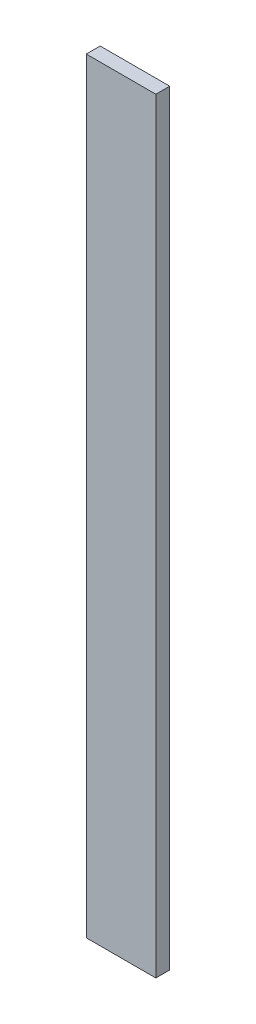
ISO-10303-21;
HEADER;
FILE_DESCRIPTION(('STEP AP214'),'2;1');
FILE_NAME('part.step','',(''),(''),'','','');
FILE_SCHEMA(('AUTOMOTIVE_DESIGN { 1 0 10303 214 1 1 1 1 }'));
ENDSEC;
DATA;
#1=APPLICATION_CONTEXT('core data for automotive mechanical design processes');
#2=APPLICATION_PROTOCOL_DEFINITION('international standard','automotive_design',2000,#1);
#3=PRODUCT_CONTEXT('',#1,'mechanical');
#4=PRODUCT('Part','Part','',(#3));
#5=PRODUCT_RELATED_PRODUCT_CATEGORY('part','',(#4));
#6=PRODUCT_DEFINITION_FORMATION('','',#4);
#7=PRODUCT_DEFINITION_CONTEXT('part definition',#1,'design');
#8=PRODUCT_DEFINITION('design','',#6,#7);
#9=PRODUCT_DEFINITION_SHAPE('','',#8);
#10=(LENGTH_UNIT() NAMED_UNIT(*) SI_UNIT(.MILLI.,.METRE.));
#11=(NAMED_UNIT(*) PLANE_ANGLE_UNIT() SI_UNIT($,.RADIAN.));
#12=(NAMED_UNIT(*) SI_UNIT($,.STERADIAN.) SOLID_ANGLE_UNIT());
#13=UNCERTAINTY_MEASURE_WITH_UNIT(LENGTH_MEASURE(1.E-05),#10,'distance_accuracy_value','');
#14=(GEOMETRIC_REPRESENTATION_CONTEXT(3) GLOBAL_UNCERTAINTY_ASSIGNED_CONTEXT((#13)) GLOBAL_UNIT_ASSIGNED_CONTEXT((#10,
#11,#12)) REPRESENTATION_CONTEXT('',''));
#15=CARTESIAN_POINT('',(0.,0.,0.));
#16=DIRECTION('',(0.,0.,1.));
#17=DIRECTION('',(1.,0.,0.));
#18=AXIS2_PLACEMENT_3D('',#15,#16,#17);
#19=CARTESIAN_POINT('',(7.5,-82.5,3.));
#20=DIRECTION('',(-1.,0.,0.));
#21=DIRECTION('',(0.,0.,1.));
#22=AXIS2_PLACEMENT_3D('',#19,#20,#21);
#23=PLANE('',#22);
#24=DIRECTION('',(0.,1.,0.));
#25=VECTOR('',#24,1.);
#26=CARTESIAN_POINT('',(7.5,-82.5,0.));
#27=LINE('',#26,#25);
#28=CARTESIAN_POINT('',(7.5,-82.5,0.));
#29=VERTEX_POINT('',#28);
#30=CARTESIAN_POINT('',(7.5,82.5,0.));
#31=VERTEX_POINT('',#30);
#32=EDGE_CURVE('E102',#29,#31,#27,.T.);
#33=ORIENTED_EDGE('',*,*,#32,.T.);
#34=DIRECTION('',(0.,0.,-1.));
#35=VECTOR('',#34,1.);
#36=CARTESIAN_POINT('',(7.5,82.5,3.));
#37=LINE('',#36,#35);
#38=CARTESIAN_POINT('',(7.5,82.5,3.));
#39=VERTEX_POINT('',#38);
#40=EDGE_CURVE('E11',#39,#31,#37,.T.);
#41=ORIENTED_EDGE('',*,*,#40,.F.);
#42=DIRECTION('',(0.,1.,0.));
#43=VECTOR('',#42,1.);
#44=CARTESIAN_POINT('',(7.5,-82.5,3.));
#45=LINE('',#44,#43);
#46=CARTESIAN_POINT('',(7.5,-82.5,3.));
#47=VERTEX_POINT('',#46);
#48=EDGE_CURVE('E90',#47,#39,#45,.T.);
#49=ORIENTED_EDGE('',*,*,#48,.F.);
#50=DIRECTION('',(0.,0.,-1.));
#51=VECTOR('',#50,1.);
#52=CARTESIAN_POINT('',(7.5,-82.5,3.));
#53=LINE('',#52,#51);
#54=EDGE_CURVE('E98',#47,#29,#53,.T.);
#55=ORIENTED_EDGE('',*,*,#54,.T.);
#56=EDGE_LOOP('',(#33,#41,#49,#55));
#57=FACE_BOUND('',#56,.T.);
#58=ADVANCED_FACE('F39',(#57),#23,.F.);
#59=CARTESIAN_POINT('',(-7.5,82.5,3.));
#60=DIRECTION('',(0.,-1.,0.));
#61=DIRECTION('',(0.,0.,-1.));
#62=AXIS2_PLACEMENT_3D('',#59,#60,#61);
#63=PLANE('',#62);
#64=DIRECTION('',(-1.,0.,0.));
#65=VECTOR('',#64,1.);
#66=CARTESIAN_POINT('',(-7.5,82.5,0.));
#67=LINE('',#66,#65);
#68=CARTESIAN_POINT('',(-7.5,82.5,0.));
#69=VERTEX_POINT('',#68);
#70=EDGE_CURVE('E94',#31,#69,#67,.T.);
#71=ORIENTED_EDGE('',*,*,#70,.T.);
#72=DIRECTION('',(0.,0.,-1.));
#73=VECTOR('',#72,1.);
#74=CARTESIAN_POINT('',(-7.5,82.5,3.));
#75=LINE('',#74,#73);
#76=CARTESIAN_POINT('',(-7.5,82.5,3.));
#77=VERTEX_POINT('',#76);
#78=EDGE_CURVE('E47',#77,#69,#75,.T.);
#79=ORIENTED_EDGE('',*,*,#78,.F.);
#80=DIRECTION('',(-1.,0.,0.));
#81=VECTOR('',#80,1.);
#82=CARTESIAN_POINT('',(-7.5,82.5,3.));
#83=LINE('',#82,#81);
#84=EDGE_CURVE('E85',#39,#77,#83,.T.);
#85=ORIENTED_EDGE('',*,*,#84,.F.);
#86=ORIENTED_EDGE('',*,*,#40,.T.);
#87=EDGE_LOOP('',(#71,#79,#85,#86));
#88=FACE_BOUND('',#87,.T.);
#89=ADVANCED_FACE('F93',(#88),#63,.F.);
#90=CARTESIAN_POINT('',(-7.5,-82.5,3.));
#91=DIRECTION('',(1.,0.,0.));
#92=DIRECTION('',(0.,0.,-1.));
#93=AXIS2_PLACEMENT_3D('',#90,#91,#92);
#94=PLANE('',#93);
#95=DIRECTION('',(0.,-1.,0.));
#96=VECTOR('',#95,1.);
#97=CARTESIAN_POINT('',(-7.5,-82.5,0.));
#98=LINE('',#97,#96);
#99=CARTESIAN_POINT('',(-7.5,-82.5,0.));
#100=VERTEX_POINT('',#99);
#101=EDGE_CURVE('E72',#69,#100,#98,.T.);
#102=ORIENTED_EDGE('',*,*,#101,.T.);
#103=DIRECTION('',(0.,0.,-1.));
#104=VECTOR('',#103,1.);
#105=CARTESIAN_POINT('',(-7.5,-82.5,3.));
#106=LINE('',#105,#104);
#107=CARTESIAN_POINT('',(-7.5,-82.5,3.));
#108=VERTEX_POINT('',#107);
#109=EDGE_CURVE('E95',#108,#100,#106,.T.);
#110=ORIENTED_EDGE('',*,*,#109,.F.);
#111=DIRECTION('',(0.,-1.,0.));
#112=VECTOR('',#111,1.);
#113=CARTESIAN_POINT('',(-7.5,-82.5,3.));
#114=LINE('',#113,#112);
#115=EDGE_CURVE('E88',#77,#108,#114,.T.);
#116=ORIENTED_EDGE('',*,*,#115,.F.);
#117=ORIENTED_EDGE('',*,*,#78,.T.);
#118=EDGE_LOOP('',(#102,#110,#116,#117));
#119=FACE_BOUND('',#118,.T.);
#120=ADVANCED_FACE('F96',(#119),#94,.F.);
#121=CARTESIAN_POINT('',(-7.5,-82.5,3.));
#122=DIRECTION('',(0.,1.,0.));
#123=DIRECTION('',(0.,0.,1.));
#124=AXIS2_PLACEMENT_3D('',#121,#122,#123);
#125=PLANE('',#124);
#126=DIRECTION('',(1.,0.,0.));
#127=VECTOR('',#126,1.);
#128=CARTESIAN_POINT('',(-7.5,-82.5,0.));
#129=LINE('',#128,#127);
#130=EDGE_CURVE('E78',#100,#29,#129,.T.);
#131=ORIENTED_EDGE('',*,*,#130,.T.);
#132=ORIENTED_EDGE('',*,*,#54,.F.);
#133=DIRECTION('',(1.,0.,0.));
#134=VECTOR('',#133,1.);
#135=CARTESIAN_POINT('',(-7.5,-82.5,3.));
#136=LINE('',#135,#134);
#137=EDGE_CURVE('E55',#108,#47,#136,.T.);
#138=ORIENTED_EDGE('',*,*,#137,.F.);
#139=ORIENTED_EDGE('',*,*,#109,.T.);
#140=EDGE_LOOP('',(#131,#132,#138,#139));
#141=FACE_BOUND('',#140,.T.);
#142=ADVANCED_FACE('F109',(#141),#125,.F.);
#143=CARTESIAN_POINT('',(0.,0.,3.));
#144=DIRECTION('',(0.,0.,-1.));
#145=DIRECTION('',(-1.,0.,0.));
#146=AXIS2_PLACEMENT_3D('',#143,#144,#145);
#147=PLANE('',#146);
#148=ORIENTED_EDGE('',*,*,#48,.T.);
#149=ORIENTED_EDGE('',*,*,#84,.T.);
#150=ORIENTED_EDGE('',*,*,#115,.T.);
#151=ORIENTED_EDGE('',*,*,#137,.T.);
#152=EDGE_LOOP('',(#148,#149,#150,#151));
#153=FACE_BOUND('',#152,.T.);
#154=ADVANCED_FACE('F86',(#153),#147,.F.);
#155=CARTESIAN_POINT('',(0.,0.,0.));
#156=DIRECTION('',(0.,0.,-1.));
#157=DIRECTION('',(-1.,0.,0.));
#158=AXIS2_PLACEMENT_3D('',#155,#156,#157);
#159=PLANE('',#158);
#160=ORIENTED_EDGE('',*,*,#32,.F.);
#161=ORIENTED_EDGE('',*,*,#130,.F.);
#162=ORIENTED_EDGE('',*,*,#101,.F.);
#163=ORIENTED_EDGE('',*,*,#70,.F.);
#164=EDGE_LOOP('',(#160,#161,#162,#163));
#165=FACE_BOUND('',#164,.T.);
#166=ADVANCED_FACE('F112',(#165),#159,.T.);
#167=CLOSED_SHELL('',(#58,#89,#120,#142,#154,#166));
#168=MANIFOLD_SOLID_BREP('B2',#167);
#169=ADVANCED_BREP_SHAPE_REPRESENTATION('',(#18,#168),#14);
#170=SHAPE_DEFINITION_REPRESENTATION(#9,#169);
ENDSEC;
END-ISO-10303-21;
